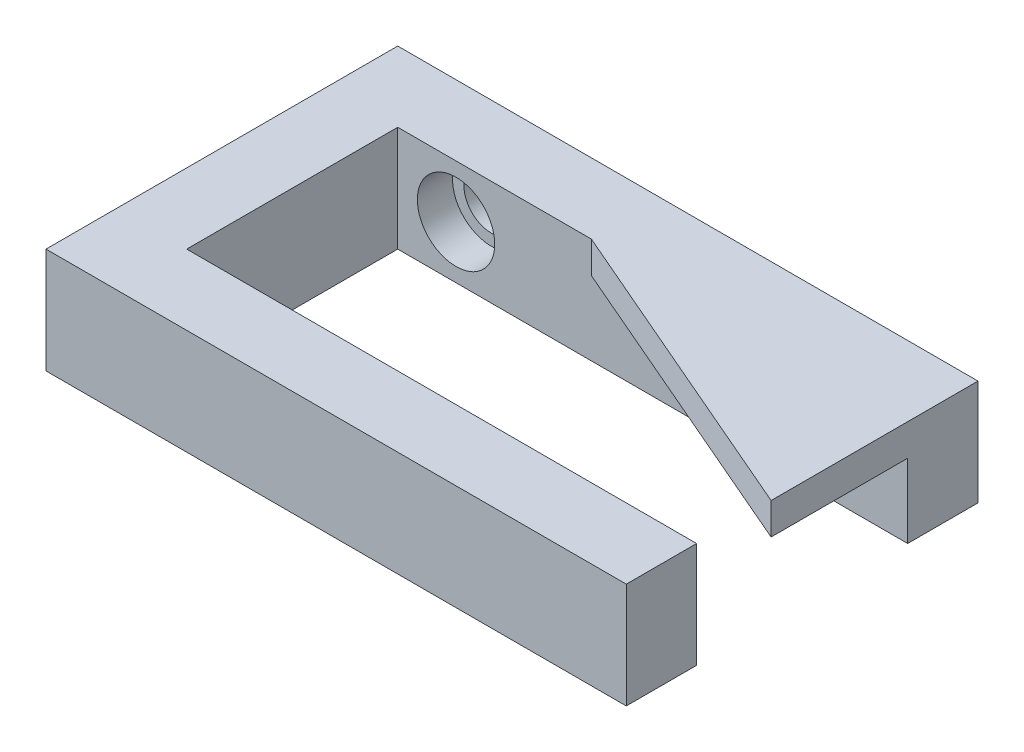
ISO-10303-21;
HEADER;
FILE_DESCRIPTION(('STEP AP214'),'2;1');
FILE_NAME('part.step','',(''),(''),'','','');
FILE_SCHEMA(('AUTOMOTIVE_DESIGN { 1 0 10303 214 1 1 1 1 }'));
ENDSEC;
DATA;
#1=APPLICATION_CONTEXT('core data for automotive mechanical design processes');
#2=APPLICATION_PROTOCOL_DEFINITION('international standard','automotive_design',2000,#1);
#3=PRODUCT_CONTEXT('',#1,'mechanical');
#4=PRODUCT('Part','Part','',(#3));
#5=PRODUCT_RELATED_PRODUCT_CATEGORY('part','',(#4));
#6=PRODUCT_DEFINITION_FORMATION('','',#4);
#7=PRODUCT_DEFINITION_CONTEXT('part definition',#1,'design');
#8=PRODUCT_DEFINITION('design','',#6,#7);
#9=PRODUCT_DEFINITION_SHAPE('','',#8);
#10=(LENGTH_UNIT() NAMED_UNIT(*) SI_UNIT(.MILLI.,.METRE.));
#11=(NAMED_UNIT(*) PLANE_ANGLE_UNIT() SI_UNIT($,.RADIAN.));
#12=(NAMED_UNIT(*) SI_UNIT($,.STERADIAN.) SOLID_ANGLE_UNIT());
#13=UNCERTAINTY_MEASURE_WITH_UNIT(LENGTH_MEASURE(1.E-05),#10,'distance_accuracy_value','');
#14=(GEOMETRIC_REPRESENTATION_CONTEXT(3) GLOBAL_UNCERTAINTY_ASSIGNED_CONTEXT((#13)) GLOBAL_UNIT_ASSIGNED_CONTEXT((#10,
#11,#12)) REPRESENTATION_CONTEXT('',''));
#15=CARTESIAN_POINT('',(0.,0.,0.));
#16=DIRECTION('',(0.,0.,1.));
#17=DIRECTION('',(1.,0.,0.));
#18=AXIS2_PLACEMENT_3D('',#15,#16,#17);
#19=CARTESIAN_POINT('',(0.,30.,0.));
#20=DIRECTION('',(0.,-1.,0.));
#21=DIRECTION('',(0.,0.,-1.));
#22=AXIS2_PLACEMENT_3D('',#19,#20,#21);
#23=PLANE('',#22);
#24=DIRECTION('',(1.,0.,0.));
#25=VECTOR('',#24,1.);
#26=CARTESIAN_POINT('',(-20.,30.,20.));
#27=LINE('',#26,#25);
#28=CARTESIAN_POINT('',(-20.,30.,20.));
#29=VERTEX_POINT('',#28);
#30=CARTESIAN_POINT('',(144.978221097427,30.,20.));
#31=VERTEX_POINT('',#30);
#32=EDGE_CURVE('E196',#29,#31,#27,.T.);
#33=ORIENTED_EDGE('',*,*,#32,.T.);
#34=DIRECTION('',(0.,0.,1.));
#35=VECTOR('',#34,1.);
#36=CARTESIAN_POINT('',(144.978221097427,30.,-99.));
#37=LINE('',#36,#35);
#38=CARTESIAN_POINT('',(144.978221097427,30.,0.));
#39=VERTEX_POINT('',#38);
#40=EDGE_CURVE('E127',#39,#31,#37,.T.);
#41=ORIENTED_EDGE('',*,*,#40,.F.);
#42=DIRECTION('',(1.,0.,0.));
#43=VECTOR('',#42,1.);
#44=CARTESIAN_POINT('',(0.,30.,0.));
#45=LINE('',#44,#43);
#46=CARTESIAN_POINT('',(0.,30.,0.));
#47=VERTEX_POINT('',#46);
#48=EDGE_CURVE('E181',#47,#39,#45,.T.);
#49=ORIENTED_EDGE('',*,*,#48,.F.);
#50=DIRECTION('',(0.,0.,1.));
#51=VECTOR('',#50,1.);
#52=CARTESIAN_POINT('',(0.,30.,0.));
#53=LINE('',#52,#51);
#54=CARTESIAN_POINT('',(0.,30.,-59.9999999999999));
#55=VERTEX_POINT('',#54);
#56=EDGE_CURVE('E179',#55,#47,#53,.T.);
#57=ORIENTED_EDGE('',*,*,#56,.F.);
#58=DIRECTION('',(-1.,0.,0.));
#59=VECTOR('',#58,1.);
#60=CARTESIAN_POINT('',(0.,30.,-59.9999999999999));
#61=LINE('',#60,#59);
#62=CARTESIAN_POINT('',(55.057032044271,30.,-60.));
#63=VERTEX_POINT('',#62);
#64=EDGE_CURVE('E184',#63,#55,#61,.T.);
#65=ORIENTED_EDGE('',*,*,#64,.F.);
#66=DIRECTION('',(0.918082968206384,0.,0.396388273652683));
#67=VECTOR('',#66,1.);
#68=CARTESIAN_POINT('',(55.057032044271,30.,-60.));
#69=LINE('',#68,#67);
#70=CARTESIAN_POINT('',(144.978221097427,30.,-21.1759436478682));
#71=VERTEX_POINT('',#70);
#72=EDGE_CURVE('E398',#63,#71,#69,.T.);
#73=ORIENTED_EDGE('',*,*,#72,.T.);
#74=CARTESIAN_POINT('',(144.978221097427,30.,-80.));
#75=VERTEX_POINT('',#74);
#76=EDGE_CURVE('E203',#75,#71,#37,.T.);
#77=ORIENTED_EDGE('',*,*,#76,.F.);
#78=DIRECTION('',(-1.,0.,0.));
#79=VECTOR('',#78,1.);
#80=CARTESIAN_POINT('',(-20.,30.,-80.));
#81=LINE('',#80,#79);
#82=CARTESIAN_POINT('',(-20.,30.,-80.));
#83=VERTEX_POINT('',#82);
#84=EDGE_CURVE('E156',#75,#83,#81,.T.);
#85=ORIENTED_EDGE('',*,*,#84,.T.);
#86=DIRECTION('',(0.,0.,1.));
#87=VECTOR('',#86,1.);
#88=CARTESIAN_POINT('',(-20.,30.,20.));
#89=LINE('',#88,#87);
#90=EDGE_CURVE('E147',#83,#29,#89,.T.);
#91=ORIENTED_EDGE('',*,*,#90,.T.);
#92=EDGE_LOOP('',(#33,#41,#49,#57,#65,#73,#77,#85,#91));
#93=FACE_BOUND('',#92,.T.);
#94=ADVANCED_FACE('F36',(#93),#23,.F.);
#95=CARTESIAN_POINT('',(0.,0.,0.));
#96=DIRECTION('',(0.,-1.,0.));
#97=DIRECTION('',(0.,0.,-1.));
#98=AXIS2_PLACEMENT_3D('',#95,#96,#97);
#99=PLANE('',#98);
#100=DIRECTION('',(0.,0.,-1.));
#101=VECTOR('',#100,1.);
#102=CARTESIAN_POINT('',(144.978221097427,0.,0.));
#103=LINE('',#102,#101);
#104=CARTESIAN_POINT('',(144.978221097427,0.,20.));
#105=VERTEX_POINT('',#104);
#106=CARTESIAN_POINT('',(144.978221097427,0.,0.));
#107=VERTEX_POINT('',#106);
#108=EDGE_CURVE('E124',#105,#107,#103,.T.);
#109=ORIENTED_EDGE('',*,*,#108,.F.);
#110=DIRECTION('',(1.,0.,0.));
#111=VECTOR('',#110,1.);
#112=CARTESIAN_POINT('',(-20.,0.,20.));
#113=LINE('',#112,#111);
#114=CARTESIAN_POINT('',(-20.,0.,20.));
#115=VERTEX_POINT('',#114);
#116=EDGE_CURVE('E135',#115,#105,#113,.T.);
#117=ORIENTED_EDGE('',*,*,#116,.F.);
#118=DIRECTION('',(0.,0.,1.));
#119=VECTOR('',#118,1.);
#120=CARTESIAN_POINT('',(-20.,0.,20.));
#121=LINE('',#120,#119);
#122=CARTESIAN_POINT('',(-20.,0.,-80.));
#123=VERTEX_POINT('',#122);
#124=EDGE_CURVE('E145',#123,#115,#121,.T.);
#125=ORIENTED_EDGE('',*,*,#124,.F.);
#126=DIRECTION('',(-1.,0.,0.));
#127=VECTOR('',#126,1.);
#128=CARTESIAN_POINT('',(-20.,0.,-80.));
#129=LINE('',#128,#127);
#130=CARTESIAN_POINT('',(144.978221097427,0.,-80.));
#131=VERTEX_POINT('',#130);
#132=EDGE_CURVE('E144',#131,#123,#129,.T.);
#133=ORIENTED_EDGE('',*,*,#132,.F.);
#134=CARTESIAN_POINT('',(144.978221097427,0.,-60.));
#135=VERTEX_POINT('',#134);
#136=EDGE_CURVE('E139',#135,#131,#103,.T.);
#137=ORIENTED_EDGE('',*,*,#136,.F.);
#138=DIRECTION('',(-1.,0.,0.));
#139=VECTOR('',#138,1.);
#140=CARTESIAN_POINT('',(0.,0.,-59.9999999999999));
#141=LINE('',#140,#139);
#142=CARTESIAN_POINT('',(0.,0.,-59.9999999999999));
#143=VERTEX_POINT('',#142);
#144=EDGE_CURVE('E59',#135,#143,#141,.T.);
#145=ORIENTED_EDGE('',*,*,#144,.T.);
#146=DIRECTION('',(0.,0.,1.));
#147=VECTOR('',#146,1.);
#148=CARTESIAN_POINT('',(0.,0.,0.));
#149=LINE('',#148,#147);
#150=CARTESIAN_POINT('',(0.,0.,0.));
#151=VERTEX_POINT('',#150);
#152=EDGE_CURVE('E169',#143,#151,#149,.T.);
#153=ORIENTED_EDGE('',*,*,#152,.T.);
#154=DIRECTION('',(1.,0.,0.));
#155=VECTOR('',#154,1.);
#156=CARTESIAN_POINT('',(0.,0.,0.));
#157=LINE('',#156,#155);
#158=EDGE_CURVE('E137',#151,#107,#157,.T.);
#159=ORIENTED_EDGE('',*,*,#158,.T.);
#160=EDGE_LOOP('',(#109,#117,#125,#133,#137,#145,#153,#159));
#161=FACE_BOUND('',#160,.T.);
#162=ADVANCED_FACE('F133',(#161),#99,.T.);
#163=CARTESIAN_POINT('',(-20.,30.,20.));
#164=DIRECTION('',(1.,0.,0.));
#165=DIRECTION('',(0.,0.,-1.));
#166=AXIS2_PLACEMENT_3D('',#163,#164,#165);
#167=PLANE('',#166);
#168=ORIENTED_EDGE('',*,*,#124,.T.);
#169=DIRECTION('',(0.,-1.,0.));
#170=VECTOR('',#169,1.);
#171=CARTESIAN_POINT('',(-20.,30.,20.));
#172=LINE('',#171,#170);
#173=EDGE_CURVE('E45',#29,#115,#172,.T.);
#174=ORIENTED_EDGE('',*,*,#173,.F.);
#175=ORIENTED_EDGE('',*,*,#90,.F.);
#176=DIRECTION('',(0.,-1.,0.));
#177=VECTOR('',#176,1.);
#178=CARTESIAN_POINT('',(-20.,30.,-80.));
#179=LINE('',#178,#177);
#180=EDGE_CURVE('E153',#83,#123,#179,.T.);
#181=ORIENTED_EDGE('',*,*,#180,.T.);
#182=EDGE_LOOP('',(#168,#174,#175,#181));
#183=FACE_BOUND('',#182,.T.);
#184=ADVANCED_FACE('F38',(#183),#167,.F.);
#185=CARTESIAN_POINT('',(-20.,30.,20.));
#186=DIRECTION('',(0.,0.,-1.));
#187=DIRECTION('',(-1.,0.,0.));
#188=AXIS2_PLACEMENT_3D('',#185,#186,#187);
#189=PLANE('',#188);
#190=ORIENTED_EDGE('',*,*,#116,.T.);
#191=DIRECTION('',(0.,-1.,0.));
#192=VECTOR('',#191,1.);
#193=CARTESIAN_POINT('',(144.978221097427,30.,20.));
#194=LINE('',#193,#192);
#195=EDGE_CURVE('E121',#31,#105,#194,.T.);
#196=ORIENTED_EDGE('',*,*,#195,.F.);
#197=ORIENTED_EDGE('',*,*,#32,.F.);
#198=ORIENTED_EDGE('',*,*,#173,.T.);
#199=EDGE_LOOP('',(#190,#196,#197,#198));
#200=FACE_BOUND('',#199,.T.);
#201=ADVANCED_FACE('F141',(#200),#189,.F.);
#202=CARTESIAN_POINT('',(-20.,30.,-80.));
#203=DIRECTION('',(0.,0.,1.));
#204=DIRECTION('',(1.,0.,0.));
#205=AXIS2_PLACEMENT_3D('',#202,#203,#204);
#206=PLANE('',#205);
#207=CARTESIAN_POINT('',(16.5795411374058,15.,-80.));
#208=DIRECTION('',(0.,0.,-1.));
#209=DIRECTION('',(-1.,0.,0.));
#210=AXIS2_PLACEMENT_3D('',#207,#208,#209);
#211=CIRCLE('',#210,7.75);
#212=CARTESIAN_POINT('',(8.82954113740582,15.,-80.));
#213=VERTEX_POINT('',#212);
#214=EDGE_CURVE('E138',#213,#213,#211,.T.);
#215=ORIENTED_EDGE('',*,*,#214,.F.);
#216=EDGE_LOOP('',(#215));
#217=FACE_BOUND('',#216,.T.);
#218=DIRECTION('',(0.,-1.,0.));
#219=VECTOR('',#218,1.);
#220=CARTESIAN_POINT('',(144.978221097427,30.,-80.));
#221=LINE('',#220,#219);
#222=EDGE_CURVE('E226',#75,#131,#221,.T.);
#223=ORIENTED_EDGE('',*,*,#222,.T.);
#224=ORIENTED_EDGE('',*,*,#132,.T.);
#225=ORIENTED_EDGE('',*,*,#180,.F.);
#226=ORIENTED_EDGE('',*,*,#84,.F.);
#227=EDGE_LOOP('',(#223,#224,#225,#226));
#228=FACE_BOUND('',#227,.T.);
#229=ADVANCED_FACE('F205',(#217,#228),#206,.F.);
#230=CARTESIAN_POINT('',(0.,30.,0.));
#231=DIRECTION('',(1.,0.,0.));
#232=DIRECTION('',(0.,0.,-1.));
#233=AXIS2_PLACEMENT_3D('',#230,#231,#232);
#234=PLANE('',#233);
#235=ORIENTED_EDGE('',*,*,#152,.F.);
#236=DIRECTION('',(0.,-1.,0.));
#237=VECTOR('',#236,1.);
#238=CARTESIAN_POINT('',(0.,30.,-59.9999999999999));
#239=LINE('',#238,#237);
#240=EDGE_CURVE('E186',#55,#143,#239,.T.);
#241=ORIENTED_EDGE('',*,*,#240,.F.);
#242=ORIENTED_EDGE('',*,*,#56,.T.);
#243=DIRECTION('',(0.,-1.,0.));
#244=VECTOR('',#243,1.);
#245=CARTESIAN_POINT('',(0.,30.,0.));
#246=LINE('',#245,#244);
#247=EDGE_CURVE('E149',#47,#151,#246,.T.);
#248=ORIENTED_EDGE('',*,*,#247,.T.);
#249=EDGE_LOOP('',(#235,#241,#242,#248));
#250=FACE_BOUND('',#249,.T.);
#251=ADVANCED_FACE('F219',(#250),#234,.T.);
#252=CARTESIAN_POINT('',(0.,30.,0.));
#253=DIRECTION('',(0.,0.,-1.));
#254=DIRECTION('',(-1.,0.,0.));
#255=AXIS2_PLACEMENT_3D('',#252,#253,#254);
#256=PLANE('',#255);
#257=DIRECTION('',(0.,1.,0.));
#258=VECTOR('',#257,1.);
#259=CARTESIAN_POINT('',(144.978221097427,30.,0.));
#260=LINE('',#259,#258);
#261=EDGE_CURVE('E225',#107,#39,#260,.T.);
#262=ORIENTED_EDGE('',*,*,#261,.F.);
#263=ORIENTED_EDGE('',*,*,#158,.F.);
#264=ORIENTED_EDGE('',*,*,#247,.F.);
#265=ORIENTED_EDGE('',*,*,#48,.T.);
#266=EDGE_LOOP('',(#262,#263,#264,#265));
#267=FACE_BOUND('',#266,.T.);
#268=CARTESIAN_POINT('',(16.5795411374058,15.,0.));
#269=DIRECTION('',(0.,0.,-1.));
#270=DIRECTION('',(-1.,0.,0.));
#271=AXIS2_PLACEMENT_3D('',#268,#269,#270);
#272=CIRCLE('',#271,11.);
#273=CARTESIAN_POINT('',(5.57954113740582,15.,0.));
#274=VERTEX_POINT('',#273);
#275=EDGE_CURVE('E165',#274,#274,#272,.T.);
#276=ORIENTED_EDGE('',*,*,#275,.F.);
#277=EDGE_LOOP('',(#276));
#278=FACE_BOUND('',#277,.T.);
#279=CARTESIAN_POINT('',(95.4698805058518,15.,0.));
#280=DIRECTION('',(0.,0.,-1.));
#281=DIRECTION('',(-1.,0.,0.));
#282=AXIS2_PLACEMENT_3D('',#279,#280,#281);
#283=CIRCLE('',#282,11.);
#284=CARTESIAN_POINT('',(84.4698805058518,15.,0.));
#285=VERTEX_POINT('',#284);
#286=EDGE_CURVE('E161',#285,#285,#283,.T.);
#287=ORIENTED_EDGE('',*,*,#286,.F.);
#288=EDGE_LOOP('',(#287));
#289=FACE_BOUND('',#288,.T.);
#290=ADVANCED_FACE('F223',(#267,#278,#289),#256,.T.);
#291=CARTESIAN_POINT('',(0.,30.,-59.9999999999999));
#292=DIRECTION('',(0.,0.,1.));
#293=DIRECTION('',(1.,0.,0.));
#294=AXIS2_PLACEMENT_3D('',#291,#292,#293);
#295=PLANE('',#294);
#296=ORIENTED_EDGE('',*,*,#144,.F.);
#297=DIRECTION('',(0.,-1.,0.));
#298=VECTOR('',#297,1.);
#299=CARTESIAN_POINT('',(144.978221097427,30.,-60.));
#300=LINE('',#299,#298);
#301=CARTESIAN_POINT('',(144.978221097427,21.,-60.));
#302=VERTEX_POINT('',#301);
#303=EDGE_CURVE('E11',#302,#135,#300,.T.);
#304=ORIENTED_EDGE('',*,*,#303,.F.);
#305=DIRECTION('',(-1.,0.,0.));
#306=VECTOR('',#305,1.);
#307=CARTESIAN_POINT('',(144.978221097427,21.,-60.));
#308=LINE('',#307,#306);
#309=CARTESIAN_POINT('',(104.689424963145,21.,-60.));
#310=VERTEX_POINT('',#309);
#311=EDGE_CURVE('E389',#302,#310,#308,.T.);
#312=ORIENTED_EDGE('',*,*,#311,.T.);
#313=CARTESIAN_POINT('',(95.4698805058518,15.,-60.));
#314=DIRECTION('',(0.,0.,1.));
#315=DIRECTION('',(1.,0.,0.));
#316=AXIS2_PLACEMENT_3D('',#313,#314,#315);
#317=CIRCLE('',#316,11.);
#318=CARTESIAN_POINT('',(86.2503360485589,21.,-60.));
#319=VERTEX_POINT('',#318);
#320=EDGE_CURVE('E162',#319,#310,#317,.T.);
#321=ORIENTED_EDGE('',*,*,#320,.F.);
#322=CARTESIAN_POINT('',(55.057032044271,21.,-60.));
#323=VERTEX_POINT('',#322);
#324=EDGE_CURVE('E392',#319,#323,#308,.T.);
#325=ORIENTED_EDGE('',*,*,#324,.T.);
#326=DIRECTION('',(0.,1.,0.));
#327=VECTOR('',#326,1.);
#328=CARTESIAN_POINT('',(55.057032044271,21.,-60.));
#329=LINE('',#328,#327);
#330=EDGE_CURVE('E407',#323,#63,#329,.T.);
#331=ORIENTED_EDGE('',*,*,#330,.T.);
#332=ORIENTED_EDGE('',*,*,#64,.T.);
#333=ORIENTED_EDGE('',*,*,#240,.T.);
#334=EDGE_LOOP('',(#296,#304,#312,#321,#325,#331,#332,#333));
#335=FACE_BOUND('',#334,.T.);
#336=CARTESIAN_POINT('',(16.5795411374058,15.,-59.9999999999999));
#337=DIRECTION('',(0.,0.,1.));
#338=DIRECTION('',(1.,0.,0.));
#339=AXIS2_PLACEMENT_3D('',#336,#337,#338);
#340=CIRCLE('',#339,11.);
#341=CARTESIAN_POINT('',(27.5795411374058,15.,-59.9999999999999));
#342=VERTEX_POINT('',#341);
#343=EDGE_CURVE('E163',#342,#342,#340,.T.);
#344=ORIENTED_EDGE('',*,*,#343,.F.);
#345=EDGE_LOOP('',(#344));
#346=FACE_BOUND('',#345,.T.);
#347=ADVANCED_FACE('F211',(#335,#346),#295,.T.);
#348=CARTESIAN_POINT('',(95.4698805058518,15.,-70.));
#349=DIRECTION('',(0.,0.,1.));
#350=DIRECTION('',(1.,0.,0.));
#351=AXIS2_PLACEMENT_3D('',#348,#349,#350);
#352=PLANE('',#351);
#353=CARTESIAN_POINT('',(95.4698805058518,15.,-70.));
#354=DIRECTION('',(0.,0.,1.));
#355=DIRECTION('',(1.,0.,0.));
#356=AXIS2_PLACEMENT_3D('',#353,#354,#355);
#357=CIRCLE('',#356,11.);
#358=CARTESIAN_POINT('',(106.469880505852,15.,-70.));
#359=VERTEX_POINT('',#358);
#360=EDGE_CURVE('E236',#359,#359,#357,.T.);
#361=ORIENTED_EDGE('',*,*,#360,.T.);
#362=EDGE_LOOP('',(#361));
#363=FACE_BOUND('',#362,.T.);
#364=ADVANCED_FACE('F316',(#363),#352,.T.);
#365=CARTESIAN_POINT('',(95.4698805058518,15.,-70.));
#366=DIRECTION('',(0.,0.,1.));
#367=DIRECTION('',(1.,0.,0.));
#368=AXIS2_PLACEMENT_3D('',#365,#366,#367);
#369=CYLINDRICAL_SURFACE('',#368,11.);
#370=EDGE_CURVE('E158',#310,#319,#317,.T.);
#371=ORIENTED_EDGE('',*,*,#370,.T.);
#372=ORIENTED_EDGE('',*,*,#320,.T.);
#373=EDGE_LOOP('',(#371,#372));
#374=FACE_BOUND('',#373,.T.);
#375=ORIENTED_EDGE('',*,*,#360,.F.);
#376=EDGE_LOOP('',(#375));
#377=FACE_BOUND('',#376,.T.);
#378=ADVANCED_FACE('F258',(#374,#377),#369,.F.);
#379=CARTESIAN_POINT('',(16.5795411374058,15.,-70.));
#380=DIRECTION('',(0.,0.,1.));
#381=DIRECTION('',(1.,0.,0.));
#382=AXIS2_PLACEMENT_3D('',#379,#380,#381);
#383=PLANE('',#382);
#384=CARTESIAN_POINT('',(16.5795411374058,15.,-70.));
#385=DIRECTION('',(0.,0.,1.));
#386=DIRECTION('',(1.,0.,0.));
#387=AXIS2_PLACEMENT_3D('',#384,#385,#386);
#388=CIRCLE('',#387,7.75);
#389=CARTESIAN_POINT('',(24.3295411374058,15.,-70.));
#390=VERTEX_POINT('',#389);
#391=EDGE_CURVE('E40',#390,#390,#388,.T.);
#392=ORIENTED_EDGE('',*,*,#391,.F.);
#393=EDGE_LOOP('',(#392));
#394=FACE_BOUND('',#393,.T.);
#395=CARTESIAN_POINT('',(16.5795411374058,15.,-70.));
#396=DIRECTION('',(0.,0.,1.));
#397=DIRECTION('',(1.,0.,0.));
#398=AXIS2_PLACEMENT_3D('',#395,#396,#397);
#399=CIRCLE('',#398,11.);
#400=CARTESIAN_POINT('',(27.5795411374058,15.,-70.));
#401=VERTEX_POINT('',#400);
#402=EDGE_CURVE('E231',#401,#401,#399,.T.);
#403=ORIENTED_EDGE('',*,*,#402,.T.);
#404=EDGE_LOOP('',(#403));
#405=FACE_BOUND('',#404,.T.);
#406=ADVANCED_FACE('F372',(#394,#405),#383,.T.);
#407=CARTESIAN_POINT('',(16.5795411374058,15.,-70.));
#408=DIRECTION('',(0.,0.,1.));
#409=DIRECTION('',(1.,0.,0.));
#410=AXIS2_PLACEMENT_3D('',#407,#408,#409);
#411=CYLINDRICAL_SURFACE('',#410,11.);
#412=ORIENTED_EDGE('',*,*,#343,.T.);
#413=EDGE_LOOP('',(#412));
#414=FACE_BOUND('',#413,.T.);
#415=ORIENTED_EDGE('',*,*,#402,.F.);
#416=EDGE_LOOP('',(#415));
#417=FACE_BOUND('',#416,.T.);
#418=ADVANCED_FACE('F256',(#414,#417),#411,.F.);
#419=ORIENTED_EDGE('',*,*,#286,.T.);
#420=EDGE_LOOP('',(#419));
#421=FACE_BOUND('',#420,.T.);
#422=CARTESIAN_POINT('',(95.4698805058518,15.,10.));
#423=DIRECTION('',(0.,0.,1.));
#424=DIRECTION('',(1.,0.,0.));
#425=AXIS2_PLACEMENT_3D('',#422,#423,#424);
#426=CIRCLE('',#425,11.);
#427=CARTESIAN_POINT('',(106.469880505852,15.,10.));
#428=VERTEX_POINT('',#427);
#429=EDGE_CURVE('E176',#428,#428,#426,.T.);
#430=ORIENTED_EDGE('',*,*,#429,.T.);
#431=EDGE_LOOP('',(#430));
#432=FACE_BOUND('',#431,.T.);
#433=ADVANCED_FACE('F243',(#421,#432),#369,.F.);
#434=CARTESIAN_POINT('',(95.4698805058518,15.,10.));
#435=DIRECTION('',(0.,0.,1.));
#436=DIRECTION('',(1.,0.,0.));
#437=AXIS2_PLACEMENT_3D('',#434,#435,#436);
#438=PLANE('',#437);
#439=ORIENTED_EDGE('',*,*,#429,.F.);
#440=EDGE_LOOP('',(#439));
#441=FACE_BOUND('',#440,.T.);
#442=ADVANCED_FACE('F245',(#441),#438,.F.);
#443=ORIENTED_EDGE('',*,*,#275,.T.);
#444=EDGE_LOOP('',(#443));
#445=FACE_BOUND('',#444,.T.);
#446=CARTESIAN_POINT('',(16.5795411374058,15.,10.));
#447=DIRECTION('',(0.,0.,1.));
#448=DIRECTION('',(1.,0.,0.));
#449=AXIS2_PLACEMENT_3D('',#446,#447,#448);
#450=CIRCLE('',#449,11.);
#451=CARTESIAN_POINT('',(27.5795411374058,15.,10.));
#452=VERTEX_POINT('',#451);
#453=EDGE_CURVE('E234',#452,#452,#450,.T.);
#454=ORIENTED_EDGE('',*,*,#453,.T.);
#455=EDGE_LOOP('',(#454));
#456=FACE_BOUND('',#455,.T.);
#457=ADVANCED_FACE('F247',(#445,#456),#411,.F.);
#458=CARTESIAN_POINT('',(16.5795411374058,15.,10.));
#459=DIRECTION('',(0.,0.,1.));
#460=DIRECTION('',(1.,0.,0.));
#461=AXIS2_PLACEMENT_3D('',#458,#459,#460);
#462=PLANE('',#461);
#463=ORIENTED_EDGE('',*,*,#453,.F.);
#464=EDGE_LOOP('',(#463));
#465=FACE_BOUND('',#464,.T.);
#466=ADVANCED_FACE('F253',(#465),#462,.F.);
#467=CARTESIAN_POINT('',(144.978221097427,30.,-99.));
#468=DIRECTION('',(-1.,0.,0.));
#469=DIRECTION('',(0.,0.,1.));
#470=AXIS2_PLACEMENT_3D('',#467,#468,#469);
#471=PLANE('',#470);
#472=ORIENTED_EDGE('',*,*,#76,.T.);
#473=DIRECTION('',(0.,1.,0.));
#474=VECTOR('',#473,1.);
#475=CARTESIAN_POINT('',(144.978221097427,21.,-21.1759436478682));
#476=LINE('',#475,#474);
#477=CARTESIAN_POINT('',(144.978221097427,21.,-21.1759436478682));
#478=VERTEX_POINT('',#477);
#479=EDGE_CURVE('E131',#478,#71,#476,.T.);
#480=ORIENTED_EDGE('',*,*,#479,.F.);
#481=DIRECTION('',(0.,0.,-1.));
#482=VECTOR('',#481,1.);
#483=CARTESIAN_POINT('',(144.978221097427,21.,-21.1759436478682));
#484=LINE('',#483,#482);
#485=EDGE_CURVE('E51',#478,#302,#484,.T.);
#486=ORIENTED_EDGE('',*,*,#485,.T.);
#487=ORIENTED_EDGE('',*,*,#303,.T.);
#488=ORIENTED_EDGE('',*,*,#136,.T.);
#489=ORIENTED_EDGE('',*,*,#222,.F.);
#490=EDGE_LOOP('',(#472,#480,#486,#487,#488,#489));
#491=FACE_BOUND('',#490,.T.);
#492=ADVANCED_FACE('F323',(#491),#471,.F.);
#493=ORIENTED_EDGE('',*,*,#261,.T.);
#494=ORIENTED_EDGE('',*,*,#40,.T.);
#495=ORIENTED_EDGE('',*,*,#195,.T.);
#496=ORIENTED_EDGE('',*,*,#108,.T.);
#497=EDGE_LOOP('',(#493,#494,#495,#496));
#498=FACE_BOUND('',#497,.T.);
#499=ADVANCED_FACE('F123',(#498),#471,.F.);
#500=CARTESIAN_POINT('',(144.978221097427,21.,-60.));
#501=DIRECTION('',(0.,0.,-1.));
#502=DIRECTION('',(-1.,0.,0.));
#503=AXIS2_PLACEMENT_3D('',#500,#501,#502);
#504=PLANE('',#503);
#505=ORIENTED_EDGE('',*,*,#370,.F.);
#506=EDGE_CURVE('E388',#310,#319,#308,.T.);
#507=ORIENTED_EDGE('',*,*,#506,.T.);
#508=EDGE_LOOP('',(#505,#507));
#509=FACE_BOUND('',#508,.T.);
#510=ADVANCED_FACE('F337',(#509),#504,.T.);
#511=CARTESIAN_POINT('',(55.057032044271,21.,-60.));
#512=DIRECTION('',(-0.396388273652684,0.,0.918082968206385));
#513=DIRECTION('',(0.918082968206385,0.,0.396388273652684));
#514=AXIS2_PLACEMENT_3D('',#511,#512,#513);
#515=PLANE('',#514);
#516=ORIENTED_EDGE('',*,*,#479,.T.);
#517=ORIENTED_EDGE('',*,*,#72,.F.);
#518=ORIENTED_EDGE('',*,*,#330,.F.);
#519=DIRECTION('',(0.918082968206384,0.,0.396388273652683));
#520=VECTOR('',#519,1.);
#521=CARTESIAN_POINT('',(55.057032044271,21.,-60.));
#522=LINE('',#521,#520);
#523=EDGE_CURVE('E394',#323,#478,#522,.T.);
#524=ORIENTED_EDGE('',*,*,#523,.T.);
#525=EDGE_LOOP('',(#516,#517,#518,#524));
#526=FACE_BOUND('',#525,.T.);
#527=ADVANCED_FACE('F346',(#526),#515,.T.);
#528=CARTESIAN_POINT('',(0.,21.,0.));
#529=DIRECTION('',(0.,-1.,0.));
#530=DIRECTION('',(0.,0.,-1.));
#531=AXIS2_PLACEMENT_3D('',#528,#529,#530);
#532=PLANE('',#531);
#533=ORIENTED_EDGE('',*,*,#311,.F.);
#534=ORIENTED_EDGE('',*,*,#485,.F.);
#535=ORIENTED_EDGE('',*,*,#523,.F.);
#536=ORIENTED_EDGE('',*,*,#324,.F.);
#537=ORIENTED_EDGE('',*,*,#506,.F.);
#538=EDGE_LOOP('',(#533,#534,#535,#536,#537));
#539=FACE_BOUND('',#538,.T.);
#540=ADVANCED_FACE('F355',(#539),#532,.T.);
#541=CARTESIAN_POINT('',(16.5795411374058,15.,-62.));
#542=DIRECTION('',(0.,0.,-1.));
#543=DIRECTION('',(-1.,0.,0.));
#544=AXIS2_PLACEMENT_3D('',#541,#542,#543);
#545=CYLINDRICAL_SURFACE('',#544,7.75);
#546=ORIENTED_EDGE('',*,*,#391,.T.);
#547=EDGE_LOOP('',(#546));
#548=FACE_BOUND('',#547,.T.);
#549=ORIENTED_EDGE('',*,*,#214,.T.);
#550=EDGE_LOOP('',(#549));
#551=FACE_BOUND('',#550,.T.);
#552=ADVANCED_FACE('F287',(#548,#551),#545,.F.);
#553=CLOSED_SHELL('',(#94,#162,#184,#201,#229,#251,#290,#347,#364,#378,#406,#418,#433,#442,#457,
#466,#492,#499,#510,#527,#540,#552));
#554=MANIFOLD_SOLID_BREP('B2',#553);
#555=ADVANCED_BREP_SHAPE_REPRESENTATION('',(#18,#554),#14);
#556=SHAPE_DEFINITION_REPRESENTATION(#9,#555);
ENDSEC;
END-ISO-10303-21;
